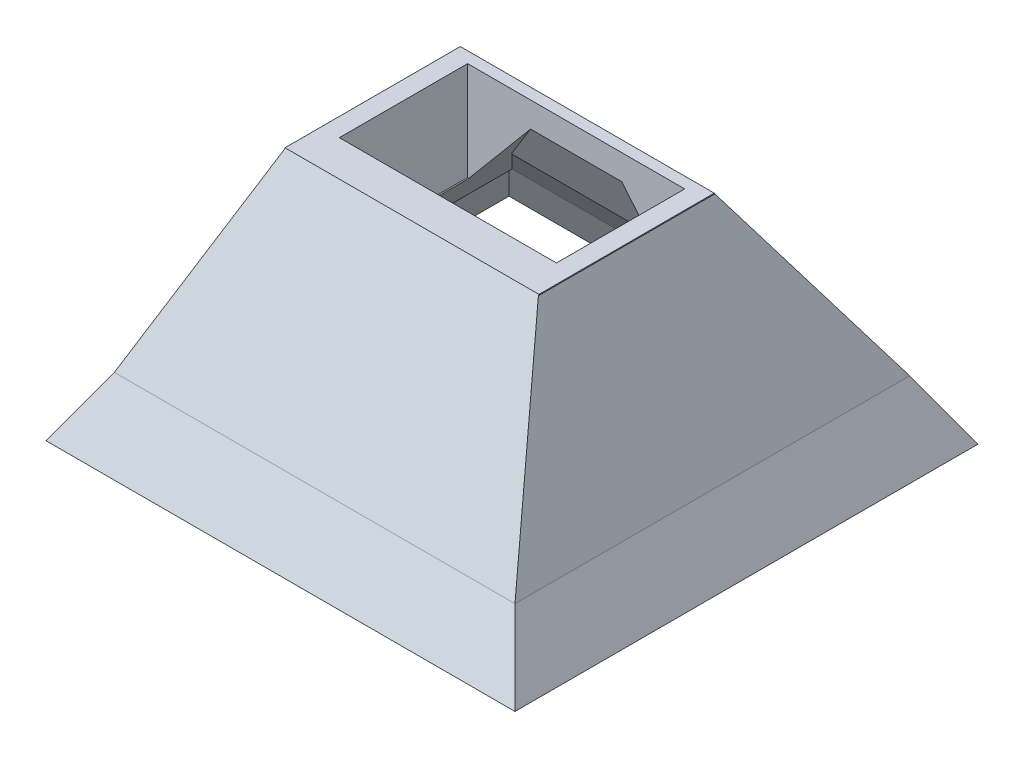
ISO-10303-21;
HEADER;
FILE_DESCRIPTION(('STEP AP214'),'2;1');
FILE_NAME('part.step','',(''),(''),'','','');
FILE_SCHEMA(('AUTOMOTIVE_DESIGN { 1 0 10303 214 1 1 1 1 }'));
ENDSEC;
DATA;
#1=APPLICATION_CONTEXT('core data for automotive mechanical design processes');
#2=APPLICATION_PROTOCOL_DEFINITION('international standard','automotive_design',2000,#1);
#3=PRODUCT_CONTEXT('',#1,'mechanical');
#4=PRODUCT('Part','Part','',(#3));
#5=PRODUCT_RELATED_PRODUCT_CATEGORY('part','',(#4));
#6=PRODUCT_DEFINITION_FORMATION('','',#4);
#7=PRODUCT_DEFINITION_CONTEXT('part definition',#1,'design');
#8=PRODUCT_DEFINITION('design','',#6,#7);
#9=PRODUCT_DEFINITION_SHAPE('','',#8);
#10=(LENGTH_UNIT() NAMED_UNIT(*) SI_UNIT(.MILLI.,.METRE.));
#11=(NAMED_UNIT(*) PLANE_ANGLE_UNIT() SI_UNIT($,.RADIAN.));
#12=(NAMED_UNIT(*) SI_UNIT($,.STERADIAN.) SOLID_ANGLE_UNIT());
#13=UNCERTAINTY_MEASURE_WITH_UNIT(LENGTH_MEASURE(1.E-05),#10,'distance_accuracy_value','');
#14=(GEOMETRIC_REPRESENTATION_CONTEXT(3) GLOBAL_UNCERTAINTY_ASSIGNED_CONTEXT((#13)) GLOBAL_UNIT_ASSIGNED_CONTEXT((#10,
#11,#12)) REPRESENTATION_CONTEXT('',''));
#15=CARTESIAN_POINT('',(0.,0.,0.));
#16=DIRECTION('',(0.,0.,1.));
#17=DIRECTION('',(1.,0.,0.));
#18=AXIS2_PLACEMENT_3D('',#15,#16,#17);
#19=CARTESIAN_POINT('',(0.,8.5,0.));
#20=DIRECTION('',(0.,-1.,0.));
#21=DIRECTION('',(0.,0.,-1.));
#22=AXIS2_PLACEMENT_3D('',#19,#20,#21);
#23=PLANE('',#22);
#24=DIRECTION('',(0.,0.,-1.));
#25=VECTOR('',#24,1.);
#26=CARTESIAN_POINT('',(-10.8676531349931,8.5,0.));
#27=LINE('',#26,#25);
#28=CARTESIAN_POINT('',(-10.8676531349931,8.5,10.8676531349931));
#29=VERTEX_POINT('',#28);
#30=CARTESIAN_POINT('',(-10.8676531349931,8.5,10.8));
#31=VERTEX_POINT('',#30);
#32=EDGE_CURVE('E412',#29,#31,#27,.T.);
#33=ORIENTED_EDGE('',*,*,#32,.T.);
#34=DIRECTION('',(1.,0.,0.));
#35=VECTOR('',#34,1.);
#36=CARTESIAN_POINT('',(10.8676531349931,8.5,10.8));
#37=LINE('',#36,#35);
#38=CARTESIAN_POINT('',(10.8676531349931,8.5,10.8));
#39=VERTEX_POINT('',#38);
#40=EDGE_CURVE('E471',#31,#39,#37,.T.);
#41=ORIENTED_EDGE('',*,*,#40,.T.);
#42=DIRECTION('',(0.,0.,1.));
#43=VECTOR('',#42,1.);
#44=CARTESIAN_POINT('',(10.8676531349931,8.5,0.));
#45=LINE('',#44,#43);
#46=CARTESIAN_POINT('',(10.8676531349931,8.5,10.8676531349931));
#47=VERTEX_POINT('',#46);
#48=EDGE_CURVE('E421',#39,#47,#45,.T.);
#49=ORIENTED_EDGE('',*,*,#48,.T.);
#50=DIRECTION('',(-1.,0.,0.));
#51=VECTOR('',#50,1.);
#52=CARTESIAN_POINT('',(0.,8.5,10.8676531349931));
#53=LINE('',#52,#51);
#54=EDGE_CURVE('E396',#47,#29,#53,.T.);
#55=ORIENTED_EDGE('',*,*,#54,.T.);
#56=EDGE_LOOP('',(#33,#41,#49,#55));
#57=FACE_BOUND('',#56,.T.);
#58=ADVANCED_FACE('F41',(#57),#23,.T.);
#59=CARTESIAN_POINT('',(18.,0.,-18.));
#60=DIRECTION('',(0.766044443118977,0.64278760968654,0.));
#61=DIRECTION('',(-0.64278760968654,0.766044443118977,0.));
#62=AXIS2_PLACEMENT_3D('',#59,#60,#61);
#63=PLANE('',#62);
#64=DIRECTION('',(0.540716203060937,-0.644400477571771,-0.540716203060937));
#65=VECTOR('',#64,1.);
#66=CARTESIAN_POINT('',(7.47453555890507,12.5437600613975,-7.47453555890508));
#67=LINE('',#66,#65);
#68=CARTESIAN_POINT('',(10.8676531349931,8.5,-10.8676531349931));
#69=VERTEX_POINT('',#68);
#70=CARTESIAN_POINT('',(18.,0.,-18.));
#71=VERTEX_POINT('',#70);
#72=EDGE_CURVE('E393',#69,#71,#67,.T.);
#73=ORIENTED_EDGE('',*,*,#72,.T.);
#74=DIRECTION('',(0.,0.,1.));
#75=VECTOR('',#74,1.);
#76=CARTESIAN_POINT('',(18.,0.,-18.));
#77=LINE('',#76,#75);
#78=CARTESIAN_POINT('',(18.,0.,18.));
#79=VERTEX_POINT('',#78);
#80=EDGE_CURVE('E232',#71,#79,#77,.T.);
#81=ORIENTED_EDGE('',*,*,#80,.T.);
#82=DIRECTION('',(0.540716203060937,-0.644400477571771,0.540716203060937));
#83=VECTOR('',#82,1.);
#84=CARTESIAN_POINT('',(7.47453555890506,12.5437600613975,7.47453555890507));
#85=LINE('',#84,#83);
#86=EDGE_CURVE('E392',#47,#79,#85,.T.);
#87=ORIENTED_EDGE('',*,*,#86,.F.);
#88=ORIENTED_EDGE('',*,*,#48,.F.);
#89=DIRECTION('',(-0.587858883152556,0.700582935935476,-0.404481746652007));
#90=VECTOR('',#89,1.);
#91=CARTESIAN_POINT('',(9.98509713369243,9.55178928521565,10.19274917305));
#92=LINE('',#91,#90);
#93=CARTESIAN_POINT('',(4.61819140160425,15.9478184725462,6.5));
#94=VERTEX_POINT('',#93);
#95=EDGE_CURVE('E483',#39,#94,#92,.T.);
#96=ORIENTED_EDGE('',*,*,#95,.T.);
#97=DIRECTION('',(-0.64278760968654,0.766044443118977,0.));
#98=VECTOR('',#97,1.);
#99=CARTESIAN_POINT('',(-3.09157313919248,25.1359580620961,6.5));
#100=LINE('',#99,#98);
#101=CARTESIAN_POINT('',(10.8676531349931,8.5,6.5));
#102=VERTEX_POINT('',#101);
#103=EDGE_CURVE('E460',#102,#94,#100,.T.);
#104=ORIENTED_EDGE('',*,*,#103,.F.);
#105=CARTESIAN_POINT('',(10.8676531349931,8.5,-6.5));
#106=VERTEX_POINT('',#105);
#107=EDGE_CURVE('E427',#106,#102,#45,.T.);
#108=ORIENTED_EDGE('',*,*,#107,.F.);
#109=DIRECTION('',(0.64278760968654,-0.766044443118977,0.));
#110=VECTOR('',#109,1.);
#111=CARTESIAN_POINT('',(-3.09157313919248,25.1359580620961,-6.5));
#112=LINE('',#111,#110);
#113=CARTESIAN_POINT('',(4.61819140160424,15.9478184725462,-6.5));
#114=VERTEX_POINT('',#113);
#115=EDGE_CURVE('E454',#114,#106,#112,.T.);
#116=ORIENTED_EDGE('',*,*,#115,.F.);
#117=DIRECTION('',(0.587858883152556,-0.700582935935476,-0.404481746652007));
#118=VECTOR('',#117,1.);
#119=CARTESIAN_POINT('',(18.5451118960204,-0.649639060448165,-16.0825465745377));
#120=LINE('',#119,#118);
#121=CARTESIAN_POINT('',(10.8676531349931,8.5,-10.8));
#122=VERTEX_POINT('',#121);
#123=EDGE_CURVE('E474',#114,#122,#120,.T.);
#124=ORIENTED_EDGE('',*,*,#123,.T.);
#125=EDGE_CURVE('E422',#69,#122,#45,.T.);
#126=ORIENTED_EDGE('',*,*,#125,.F.);
#127=EDGE_LOOP('',(#73,#81,#87,#88,#96,#104,#108,#116,#124,#126));
#128=FACE_BOUND('',#127,.T.);
#129=ADVANCED_FACE('F520',(#128),#63,.F.);
#130=CARTESIAN_POINT('',(-18.,0.,-18.));
#131=DIRECTION('',(0.,0.64278760968654,-0.766044443118977));
#132=DIRECTION('',(0.,0.766044443118977,0.64278760968654));
#133=AXIS2_PLACEMENT_3D('',#130,#131,#132);
#134=PLANE('',#133);
#135=DIRECTION('',(-0.540716203060937,-0.644400477571771,-0.540716203060937));
#136=VECTOR('',#135,1.);
#137=CARTESIAN_POINT('',(-18.,0.,-18.));
#138=LINE('',#137,#136);
#139=CARTESIAN_POINT('',(-10.8676531349931,8.5,-10.8676531349931));
#140=VERTEX_POINT('',#139);
#141=CARTESIAN_POINT('',(-18.,0.,-18.));
#142=VERTEX_POINT('',#141);
#143=EDGE_CURVE('E397',#140,#142,#138,.T.);
#144=ORIENTED_EDGE('',*,*,#143,.T.);
#145=DIRECTION('',(1.,0.,0.));
#146=VECTOR('',#145,1.);
#147=CARTESIAN_POINT('',(-18.,0.,-18.));
#148=LINE('',#147,#146);
#149=EDGE_CURVE('E388',#142,#71,#148,.T.);
#150=ORIENTED_EDGE('',*,*,#149,.T.);
#151=ORIENTED_EDGE('',*,*,#72,.F.);
#152=DIRECTION('',(1.,0.,0.));
#153=VECTOR('',#152,1.);
#154=CARTESIAN_POINT('',(0.,8.5,-10.8676531349931));
#155=LINE('',#154,#153);
#156=EDGE_CURVE('E416',#140,#69,#155,.T.);
#157=ORIENTED_EDGE('',*,*,#156,.F.);
#158=EDGE_LOOP('',(#144,#150,#151,#157));
#159=FACE_BOUND('',#158,.T.);
#160=ADVANCED_FACE('F525',(#159),#134,.F.);
#161=CARTESIAN_POINT('',(-18.,0.,-18.));
#162=DIRECTION('',(-0.766044443118977,0.64278760968654,0.));
#163=DIRECTION('',(-0.64278760968654,-0.766044443118977,0.));
#164=AXIS2_PLACEMENT_3D('',#161,#162,#163);
#165=PLANE('',#164);
#166=DIRECTION('',(-0.540716203060937,-0.644400477571771,0.540716203060937));
#167=VECTOR('',#166,1.);
#168=CARTESIAN_POINT('',(-18.,0.,18.));
#169=LINE('',#168,#167);
#170=CARTESIAN_POINT('',(-18.,0.,18.));
#171=VERTEX_POINT('',#170);
#172=EDGE_CURVE('E401',#29,#171,#169,.T.);
#173=ORIENTED_EDGE('',*,*,#172,.T.);
#174=DIRECTION('',(0.,0.,-1.));
#175=VECTOR('',#174,1.);
#176=CARTESIAN_POINT('',(-18.,0.,-18.));
#177=LINE('',#176,#175);
#178=EDGE_CURVE('E384',#171,#142,#177,.T.);
#179=ORIENTED_EDGE('',*,*,#178,.T.);
#180=ORIENTED_EDGE('',*,*,#143,.F.);
#181=CARTESIAN_POINT('',(-10.8676531349931,8.5,-10.8));
#182=VERTEX_POINT('',#181);
#183=EDGE_CURVE('E411',#182,#140,#27,.T.);
#184=ORIENTED_EDGE('',*,*,#183,.F.);
#185=DIRECTION('',(0.587858883152556,0.700582935935476,0.404481746652007));
#186=VECTOR('',#185,1.);
#187=CARTESIAN_POINT('',(-18.5451118960204,-0.649639060448165,-16.0825465745377));
#188=LINE('',#187,#186);
#189=CARTESIAN_POINT('',(-4.61819140160425,15.9478184725462,-6.5));
#190=VERTEX_POINT('',#189);
#191=EDGE_CURVE('E477',#182,#190,#188,.T.);
#192=ORIENTED_EDGE('',*,*,#191,.T.);
#193=DIRECTION('',(0.64278760968654,0.766044443118977,0.));
#194=VECTOR('',#193,1.);
#195=CARTESIAN_POINT('',(-5.99829690647131,14.3030727789618,-6.5));
#196=LINE('',#195,#194);
#197=CARTESIAN_POINT('',(-10.8676531349931,8.5,-6.5));
#198=VERTEX_POINT('',#197);
#199=EDGE_CURVE('E446',#198,#190,#196,.T.);
#200=ORIENTED_EDGE('',*,*,#199,.F.);
#201=CARTESIAN_POINT('',(-10.8676531349931,8.5,6.5));
#202=VERTEX_POINT('',#201);
#203=EDGE_CURVE('E417',#202,#198,#27,.T.);
#204=ORIENTED_EDGE('',*,*,#203,.F.);
#205=DIRECTION('',(-0.64278760968654,-0.766044443118977,0.));
#206=VECTOR('',#205,1.);
#207=CARTESIAN_POINT('',(-5.99829690647131,14.3030727789618,6.5));
#208=LINE('',#207,#206);
#209=CARTESIAN_POINT('',(-4.61819140160426,15.9478184725462,6.5));
#210=VERTEX_POINT('',#209);
#211=EDGE_CURVE('E468',#210,#202,#208,.T.);
#212=ORIENTED_EDGE('',*,*,#211,.F.);
#213=DIRECTION('',(-0.587858883152556,-0.700582935935476,0.404481746652007));
#214=VECTOR('',#213,1.);
#215=CARTESIAN_POINT('',(-9.98509713369243,9.55178928521565,10.19274917305));
#216=LINE('',#215,#214);
#217=EDGE_CURVE('E480',#210,#31,#216,.T.);
#218=ORIENTED_EDGE('',*,*,#217,.T.);
#219=ORIENTED_EDGE('',*,*,#32,.F.);
#220=EDGE_LOOP('',(#173,#179,#180,#184,#192,#200,#204,#212,#218,#219));
#221=FACE_BOUND('',#220,.T.);
#222=ADVANCED_FACE('F512',(#221),#165,.F.);
#223=CARTESIAN_POINT('',(-18.,0.,18.));
#224=DIRECTION('',(0.,0.64278760968654,0.766044443118977));
#225=DIRECTION('',(0.,-0.766044443118977,0.64278760968654));
#226=AXIS2_PLACEMENT_3D('',#223,#224,#225);
#227=PLANE('',#226);
#228=ORIENTED_EDGE('',*,*,#86,.T.);
#229=DIRECTION('',(-1.,0.,0.));
#230=VECTOR('',#229,1.);
#231=CARTESIAN_POINT('',(-18.,0.,18.));
#232=LINE('',#231,#230);
#233=EDGE_CURVE('E380',#79,#171,#232,.T.);
#234=ORIENTED_EDGE('',*,*,#233,.T.);
#235=ORIENTED_EDGE('',*,*,#172,.F.);
#236=ORIENTED_EDGE('',*,*,#54,.F.);
#237=EDGE_LOOP('',(#228,#234,#235,#236));
#238=FACE_BOUND('',#237,.T.);
#239=ADVANCED_FACE('F516',(#238),#227,.F.);
#240=ORIENTED_EDGE('',*,*,#125,.T.);
#241=DIRECTION('',(-1.,0.,0.));
#242=VECTOR('',#241,1.);
#243=CARTESIAN_POINT('',(-10.8676531349931,8.5,-10.8));
#244=LINE('',#243,#242);
#245=EDGE_CURVE('E457',#122,#182,#244,.T.);
#246=ORIENTED_EDGE('',*,*,#245,.T.);
#247=ORIENTED_EDGE('',*,*,#183,.T.);
#248=ORIENTED_EDGE('',*,*,#156,.T.);
#249=EDGE_LOOP('',(#240,#246,#247,#248));
#250=FACE_BOUND('',#249,.T.);
#251=ADVANCED_FACE('F574',(#250),#23,.T.);
#252=CARTESIAN_POINT('',(12.8676531349931,18.5,12.8676531349931));
#253=DIRECTION('',(-1.,0.,0.));
#254=DIRECTION('',(0.,0.,1.));
#255=AXIS2_PLACEMENT_3D('',#252,#253,#254);
#256=PLANE('',#255);
#257=DIRECTION('',(0.,0.,-1.));
#258=VECTOR('',#257,1.);
#259=CARTESIAN_POINT('',(12.8676531349931,18.398928629861,-12.8676531349931));
#260=LINE('',#259,#258);
#261=CARTESIAN_POINT('',(12.8676531349931,18.398928629861,10.1938683086254));
#262=VERTEX_POINT('',#261);
#263=CARTESIAN_POINT('',(12.8676531349931,18.398928629861,-7.69758123506049));
#264=VERTEX_POINT('',#263);
#265=EDGE_CURVE('E426',#262,#264,#260,.T.);
#266=ORIENTED_EDGE('',*,*,#265,.T.);
#267=DIRECTION('',(0.,0.831289081728702,0.555840321134273));
#268=VECTOR('',#267,1.);
#269=CARTESIAN_POINT('',(12.8676531349931,27.9712273961323,-1.29707660053211));
#270=LINE('',#269,#268);
#271=CARTESIAN_POINT('',(12.8676531349931,18.5,-7.63));
#272=VERTEX_POINT('',#271);
#273=EDGE_CURVE('E66',#264,#272,#270,.T.);
#274=ORIENTED_EDGE('',*,*,#273,.T.);
#275=DIRECTION('',(0.,0.,-1.));
#276=VECTOR('',#275,1.);
#277=CARTESIAN_POINT('',(12.8676531349931,18.5,12.8676531349931));
#278=LINE('',#277,#276);
#279=CARTESIAN_POINT('',(12.8676531349931,18.5,10.14));
#280=VERTEX_POINT('',#279);
#281=EDGE_CURVE('E362',#280,#272,#278,.T.);
#282=ORIENTED_EDGE('',*,*,#281,.F.);
#283=DIRECTION('',(0.,-0.88248495319256,0.470340629106954));
#284=VECTOR('',#283,1.);
#285=CARTESIAN_POINT('',(12.8676531349931,17.3678370281947,10.743412264973));
#286=LINE('',#285,#284);
#287=EDGE_CURVE('E309',#280,#262,#286,.T.);
#288=ORIENTED_EDGE('',*,*,#287,.T.);
#289=EDGE_LOOP('',(#266,#274,#282,#288));
#290=FACE_BOUND('',#289,.T.);
#291=ADVANCED_FACE('F582',(#290),#256,.F.);
#292=CARTESIAN_POINT('',(-12.8676531349931,18.5,12.8676531349931));
#293=DIRECTION('',(1.,0.,0.));
#294=DIRECTION('',(0.,0.,-1.));
#295=AXIS2_PLACEMENT_3D('',#292,#293,#294);
#296=PLANE('',#295);
#297=DIRECTION('',(0.,0.,1.));
#298=VECTOR('',#297,1.);
#299=CARTESIAN_POINT('',(-12.8676531349931,18.5,12.8676531349931));
#300=LINE('',#299,#298);
#301=CARTESIAN_POINT('',(-12.8676531349931,18.5,-7.63));
#302=VERTEX_POINT('',#301);
#303=CARTESIAN_POINT('',(-12.8676531349931,18.5,10.14));
#304=VERTEX_POINT('',#303);
#305=EDGE_CURVE('E375',#302,#304,#300,.T.);
#306=ORIENTED_EDGE('',*,*,#305,.F.);
#307=DIRECTION('',(0.,-0.831289081728702,-0.555840321134273));
#308=VECTOR('',#307,1.);
#309=CARTESIAN_POINT('',(-12.8676531349931,27.9712273961323,-1.29707660053211));
#310=LINE('',#309,#308);
#311=CARTESIAN_POINT('',(-12.8676531349931,18.398928629861,-7.69758123506048));
#312=VERTEX_POINT('',#311);
#313=EDGE_CURVE('E300',#302,#312,#310,.T.);
#314=ORIENTED_EDGE('',*,*,#313,.T.);
#315=DIRECTION('',(0.,0.,1.));
#316=VECTOR('',#315,1.);
#317=CARTESIAN_POINT('',(-12.8676531349931,18.398928629861,12.8676531349931));
#318=LINE('',#317,#316);
#319=CARTESIAN_POINT('',(-12.8676531349931,18.398928629861,10.1938683086254));
#320=VERTEX_POINT('',#319);
#321=EDGE_CURVE('E431',#312,#320,#318,.T.);
#322=ORIENTED_EDGE('',*,*,#321,.T.);
#323=DIRECTION('',(0.,0.88248495319256,-0.470340629106954));
#324=VECTOR('',#323,1.);
#325=CARTESIAN_POINT('',(-12.8676531349931,17.3678370281947,10.743412264973));
#326=LINE('',#325,#324);
#327=EDGE_CURVE('E319',#320,#304,#326,.T.);
#328=ORIENTED_EDGE('',*,*,#327,.T.);
#329=EDGE_LOOP('',(#306,#314,#322,#328));
#330=FACE_BOUND('',#329,.T.);
#331=ADVANCED_FACE('F566',(#330),#296,.F.);
#332=CARTESIAN_POINT('',(0.,18.5,0.));
#333=DIRECTION('',(0.,-1.,0.));
#334=DIRECTION('',(0.,0.,-1.));
#335=AXIS2_PLACEMENT_3D('',#332,#333,#334);
#336=PLANE('',#335);
#337=DIRECTION('',(1.,0.,0.));
#338=VECTOR('',#337,1.);
#339=CARTESIAN_POINT('',(-11.,18.5,-6.5));
#340=LINE('',#339,#338);
#341=CARTESIAN_POINT('',(-11.,18.5,-6.5));
#342=VERTEX_POINT('',#341);
#343=CARTESIAN_POINT('',(11.,18.5,-6.5));
#344=VERTEX_POINT('',#343);
#345=EDGE_CURVE('E337',#342,#344,#340,.T.);
#346=ORIENTED_EDGE('',*,*,#345,.T.);
#347=DIRECTION('',(0.,0.,1.));
#348=VECTOR('',#347,1.);
#349=CARTESIAN_POINT('',(11.,18.5,-6.5));
#350=LINE('',#349,#348);
#351=CARTESIAN_POINT('',(11.,18.5,6.5));
#352=VERTEX_POINT('',#351);
#353=EDGE_CURVE('E324',#344,#352,#350,.T.);
#354=ORIENTED_EDGE('',*,*,#353,.T.);
#355=DIRECTION('',(-1.,0.,0.));
#356=VECTOR('',#355,1.);
#357=CARTESIAN_POINT('',(-11.,18.5,6.5));
#358=LINE('',#357,#356);
#359=CARTESIAN_POINT('',(-11.,18.5,6.5));
#360=VERTEX_POINT('',#359);
#361=EDGE_CURVE('E328',#352,#360,#358,.T.);
#362=ORIENTED_EDGE('',*,*,#361,.T.);
#363=DIRECTION('',(0.,0.,-1.));
#364=VECTOR('',#363,1.);
#365=CARTESIAN_POINT('',(-11.,18.5,-6.5));
#366=LINE('',#365,#364);
#367=EDGE_CURVE('E333',#360,#342,#366,.T.);
#368=ORIENTED_EDGE('',*,*,#367,.T.);
#369=EDGE_LOOP('',(#346,#354,#362,#368));
#370=FACE_BOUND('',#369,.T.);
#371=ORIENTED_EDGE('',*,*,#281,.T.);
#372=DIRECTION('',(1.,0.,0.));
#373=VECTOR('',#372,1.);
#374=CARTESIAN_POINT('',(-20.3013028287262,18.5,-7.63));
#375=LINE('',#374,#373);
#376=EDGE_CURVE('E289',#302,#272,#375,.T.);
#377=ORIENTED_EDGE('',*,*,#376,.F.);
#378=ORIENTED_EDGE('',*,*,#305,.T.);
#379=DIRECTION('',(1.,0.,0.));
#380=VECTOR('',#379,1.);
#381=CARTESIAN_POINT('',(-20.3013028287262,18.5,10.14));
#382=LINE('',#381,#380);
#383=EDGE_CURVE('E305',#304,#280,#382,.T.);
#384=ORIENTED_EDGE('',*,*,#383,.T.);
#385=EDGE_LOOP('',(#371,#377,#378,#384));
#386=FACE_BOUND('',#385,.T.);
#387=ADVANCED_FACE('F558',(#370,#386),#336,.F.);
#388=CARTESIAN_POINT('',(0.,8.5,0.));
#389=DIRECTION('',(0.,1.,0.));
#390=DIRECTION('',(0.,0.,1.));
#391=AXIS2_PLACEMENT_3D('',#388,#389,#390);
#392=PLANE('',#391);
#393=ORIENTED_EDGE('',*,*,#203,.T.);
#394=DIRECTION('',(1.,0.,0.));
#395=VECTOR('',#394,1.);
#396=CARTESIAN_POINT('',(-11.,8.5,-6.5));
#397=LINE('',#396,#395);
#398=CARTESIAN_POINT('',(-11.,8.5,-6.5));
#399=VERTEX_POINT('',#398);
#400=EDGE_CURVE('E329',#399,#198,#397,.T.);
#401=ORIENTED_EDGE('',*,*,#400,.F.);
#402=DIRECTION('',(0.,0.,-1.));
#403=VECTOR('',#402,1.);
#404=CARTESIAN_POINT('',(-11.,8.5,-6.5));
#405=LINE('',#404,#403);
#406=CARTESIAN_POINT('',(-11.,8.5,6.5));
#407=VERTEX_POINT('',#406);
#408=EDGE_CURVE('E350',#407,#399,#405,.T.);
#409=ORIENTED_EDGE('',*,*,#408,.F.);
#410=DIRECTION('',(-1.,0.,0.));
#411=VECTOR('',#410,1.);
#412=CARTESIAN_POINT('',(-11.,8.5,6.5));
#413=LINE('',#412,#411);
#414=EDGE_CURVE('E345',#202,#407,#413,.T.);
#415=ORIENTED_EDGE('',*,*,#414,.F.);
#416=EDGE_LOOP('',(#393,#401,#409,#415));
#417=FACE_BOUND('',#416,.T.);
#418=ADVANCED_FACE('F555',(#417),#392,.T.);
#419=ORIENTED_EDGE('',*,*,#107,.T.);
#420=CARTESIAN_POINT('',(11.,8.5,6.5));
#421=VERTEX_POINT('',#420);
#422=EDGE_CURVE('E346',#421,#102,#413,.T.);
#423=ORIENTED_EDGE('',*,*,#422,.F.);
#424=DIRECTION('',(0.,0.,1.));
#425=VECTOR('',#424,1.);
#426=CARTESIAN_POINT('',(11.,8.5,-6.5));
#427=LINE('',#426,#425);
#428=CARTESIAN_POINT('',(11.,8.5,-6.5));
#429=VERTEX_POINT('',#428);
#430=EDGE_CURVE('E323',#429,#421,#427,.T.);
#431=ORIENTED_EDGE('',*,*,#430,.F.);
#432=EDGE_CURVE('E354',#106,#429,#397,.T.);
#433=ORIENTED_EDGE('',*,*,#432,.F.);
#434=EDGE_LOOP('',(#419,#423,#431,#433));
#435=FACE_BOUND('',#434,.T.);
#436=ADVANCED_FACE('F557',(#435),#392,.T.);
#437=CARTESIAN_POINT('',(11.,18.5,-6.5));
#438=DIRECTION('',(1.,0.,0.));
#439=DIRECTION('',(0.,0.,-1.));
#440=AXIS2_PLACEMENT_3D('',#437,#438,#439);
#441=PLANE('',#440);
#442=ORIENTED_EDGE('',*,*,#430,.T.);
#443=DIRECTION('',(0.,-1.,0.));
#444=VECTOR('',#443,1.);
#445=CARTESIAN_POINT('',(11.,18.5,6.5));
#446=LINE('',#445,#444);
#447=EDGE_CURVE('E341',#352,#421,#446,.T.);
#448=ORIENTED_EDGE('',*,*,#447,.F.);
#449=ORIENTED_EDGE('',*,*,#353,.F.);
#450=DIRECTION('',(0.,-1.,0.));
#451=VECTOR('',#450,1.);
#452=CARTESIAN_POINT('',(11.,18.5,-6.5));
#453=LINE('',#452,#451);
#454=EDGE_CURVE('E358',#344,#429,#453,.T.);
#455=ORIENTED_EDGE('',*,*,#454,.T.);
#456=EDGE_LOOP('',(#442,#448,#449,#455));
#457=FACE_BOUND('',#456,.T.);
#458=ADVANCED_FACE('F564',(#457),#441,.F.);
#459=CARTESIAN_POINT('',(-11.,18.5,-6.5));
#460=DIRECTION('',(0.,0.,-1.));
#461=DIRECTION('',(-1.,0.,0.));
#462=AXIS2_PLACEMENT_3D('',#459,#460,#461);
#463=PLANE('',#462);
#464=DIRECTION('',(1.,0.,0.));
#465=VECTOR('',#464,1.);
#466=CARTESIAN_POINT('',(10.8676531349931,15.9478184725462,-6.5));
#467=LINE('',#466,#465);
#468=EDGE_CURVE('E450',#190,#114,#467,.T.);
#469=ORIENTED_EDGE('',*,*,#468,.T.);
#470=ORIENTED_EDGE('',*,*,#115,.T.);
#471=ORIENTED_EDGE('',*,*,#432,.T.);
#472=ORIENTED_EDGE('',*,*,#454,.F.);
#473=ORIENTED_EDGE('',*,*,#345,.F.);
#474=DIRECTION('',(0.,-1.,0.));
#475=VECTOR('',#474,1.);
#476=CARTESIAN_POINT('',(-11.,18.5,-6.5));
#477=LINE('',#476,#475);
#478=EDGE_CURVE('E363',#342,#399,#477,.T.);
#479=ORIENTED_EDGE('',*,*,#478,.T.);
#480=ORIENTED_EDGE('',*,*,#400,.T.);
#481=ORIENTED_EDGE('',*,*,#199,.T.);
#482=EDGE_LOOP('',(#469,#470,#471,#472,#473,#479,#480,#481));
#483=FACE_BOUND('',#482,.T.);
#484=ADVANCED_FACE('F536',(#483),#463,.F.);
#485=CARTESIAN_POINT('',(-11.,18.5,-6.5));
#486=DIRECTION('',(-1.,0.,0.));
#487=DIRECTION('',(0.,0.,1.));
#488=AXIS2_PLACEMENT_3D('',#485,#486,#487);
#489=PLANE('',#488);
#490=ORIENTED_EDGE('',*,*,#408,.T.);
#491=ORIENTED_EDGE('',*,*,#478,.F.);
#492=ORIENTED_EDGE('',*,*,#367,.F.);
#493=DIRECTION('',(0.,-1.,0.));
#494=VECTOR('',#493,1.);
#495=CARTESIAN_POINT('',(-11.,18.5,6.5));
#496=LINE('',#495,#494);
#497=EDGE_CURVE('E366',#360,#407,#496,.T.);
#498=ORIENTED_EDGE('',*,*,#497,.T.);
#499=EDGE_LOOP('',(#490,#491,#492,#498));
#500=FACE_BOUND('',#499,.T.);
#501=ADVANCED_FACE('F554',(#500),#489,.F.);
#502=CARTESIAN_POINT('',(-11.,18.5,6.5));
#503=DIRECTION('',(0.,0.,1.));
#504=DIRECTION('',(1.,0.,0.));
#505=AXIS2_PLACEMENT_3D('',#502,#503,#504);
#506=PLANE('',#505);
#507=DIRECTION('',(-1.,0.,0.));
#508=VECTOR('',#507,1.);
#509=CARTESIAN_POINT('',(-10.8676531349931,15.9478184725462,6.5));
#510=LINE('',#509,#508);
#511=EDGE_CURVE('E464',#94,#210,#510,.T.);
#512=ORIENTED_EDGE('',*,*,#511,.T.);
#513=ORIENTED_EDGE('',*,*,#211,.T.);
#514=ORIENTED_EDGE('',*,*,#414,.T.);
#515=ORIENTED_EDGE('',*,*,#497,.F.);
#516=ORIENTED_EDGE('',*,*,#361,.F.);
#517=ORIENTED_EDGE('',*,*,#447,.T.);
#518=ORIENTED_EDGE('',*,*,#422,.T.);
#519=ORIENTED_EDGE('',*,*,#103,.T.);
#520=EDGE_LOOP('',(#512,#513,#514,#515,#516,#517,#518,#519));
#521=FACE_BOUND('',#520,.T.);
#522=ADVANCED_FACE('F550',(#521),#506,.F.);
#523=CARTESIAN_POINT('',(-12.8676531349931,18.398928629861,12.8676531349931));
#524=DIRECTION('',(0.927183854566789,-0.374606593415909,0.));
#525=DIRECTION('',(0.,0.,1.));
#526=AXIS2_PLACEMENT_3D('',#523,#524,#525);
#527=PLANE('',#526);
#528=ORIENTED_EDGE('',*,*,#321,.F.);
#529=DIRECTION('',(-0.318384822463637,-0.788030088407036,-0.52691525370784));
#530=VECTOR('',#529,1.);
#531=CARTESIAN_POINT('',(-9.417591998523,26.9381295922207,-1.98785605103943));
#532=LINE('',#531,#530);
#533=CARTESIAN_POINT('',(-20.3013028287262,0.,-20.));
#534=VERTEX_POINT('',#533);
#535=EDGE_CURVE('E297',#312,#534,#532,.T.);
#536=ORIENTED_EDGE('',*,*,#535,.T.);
#537=DIRECTION('',(0.,0.,-1.));
#538=VECTOR('',#537,1.);
#539=CARTESIAN_POINT('',(-20.3013028287262,0.,12.8676531349931));
#540=LINE('',#539,#538);
#541=CARTESIAN_POINT('',(-20.3013028287262,0.,20.));
#542=VERTEX_POINT('',#541);
#543=EDGE_CURVE('E438',#542,#534,#540,.T.);
#544=ORIENTED_EDGE('',*,*,#543,.F.);
#545=DIRECTION('',(0.335838644601319,0.83122981412188,-0.44302302525631));
#546=VECTOR('',#545,1.);
#547=CARTESIAN_POINT('',(-13.2654702112735,17.4142968142949,10.7186504546515));
#548=LINE('',#547,#546);
#549=EDGE_CURVE('E315',#542,#320,#548,.T.);
#550=ORIENTED_EDGE('',*,*,#549,.T.);
#551=EDGE_LOOP('',(#528,#536,#544,#550));
#552=FACE_BOUND('',#551,.T.);
#553=ADVANCED_FACE('F607',(#552),#527,.F.);
#554=CARTESIAN_POINT('',(12.8676531349931,18.398928629861,12.8676531349931));
#555=DIRECTION('',(-0.927183854566789,-0.374606593415909,0.));
#556=DIRECTION('',(0.,0.,-1.));
#557=AXIS2_PLACEMENT_3D('',#554,#555,#556);
#558=PLANE('',#557);
#559=DIRECTION('',(0.,0.,1.));
#560=VECTOR('',#559,1.);
#561=CARTESIAN_POINT('',(20.3013028287262,0.,12.8676531349931));
#562=LINE('',#561,#560);
#563=CARTESIAN_POINT('',(20.3013028287262,0.,-20.));
#564=VERTEX_POINT('',#563);
#565=CARTESIAN_POINT('',(20.3013028287262,0.,20.));
#566=VERTEX_POINT('',#565);
#567=EDGE_CURVE('E434',#564,#566,#562,.T.);
#568=ORIENTED_EDGE('',*,*,#567,.F.);
#569=DIRECTION('',(-0.318384822463637,0.788030088407036,0.52691525370784));
#570=VECTOR('',#569,1.);
#571=CARTESIAN_POINT('',(9.417591998523,26.9381295922207,-1.98785605103944));
#572=LINE('',#571,#570);
#573=EDGE_CURVE('E486',#564,#264,#572,.T.);
#574=ORIENTED_EDGE('',*,*,#573,.T.);
#575=ORIENTED_EDGE('',*,*,#265,.F.);
#576=DIRECTION('',(0.335838644601319,-0.83122981412188,0.44302302525631));
#577=VECTOR('',#576,1.);
#578=CARTESIAN_POINT('',(13.2654702112735,17.4142968142949,10.7186504546515));
#579=LINE('',#578,#577);
#580=EDGE_CURVE('E442',#262,#566,#579,.T.);
#581=ORIENTED_EDGE('',*,*,#580,.T.);
#582=EDGE_LOOP('',(#568,#574,#575,#581));
#583=FACE_BOUND('',#582,.T.);
#584=ADVANCED_FACE('F599',(#583),#558,.F.);
#585=CARTESIAN_POINT('',(-20.3013028287262,18.5,10.14));
#586=DIRECTION('',(0.,-0.470340629106954,-0.88248495319256));
#587=DIRECTION('',(0.,0.88248495319256,-0.470340629106954));
#588=AXIS2_PLACEMENT_3D('',#585,#586,#587);
#589=PLANE('',#588);
#590=ORIENTED_EDGE('',*,*,#549,.F.);
#591=DIRECTION('',(1.,0.,0.));
#592=VECTOR('',#591,1.);
#593=CARTESIAN_POINT('',(-20.3013028287262,0.,20.));
#594=LINE('',#593,#592);
#595=EDGE_CURVE('E304',#542,#566,#594,.T.);
#596=ORIENTED_EDGE('',*,*,#595,.T.);
#597=ORIENTED_EDGE('',*,*,#580,.F.);
#598=ORIENTED_EDGE('',*,*,#287,.F.);
#599=ORIENTED_EDGE('',*,*,#383,.F.);
#600=ORIENTED_EDGE('',*,*,#327,.F.);
#601=EDGE_LOOP('',(#590,#596,#597,#598,#599,#600));
#602=FACE_BOUND('',#601,.T.);
#603=ADVANCED_FACE('F606',(#602),#589,.F.);
#604=CARTESIAN_POINT('',(-11.,15.9478184725462,-6.5));
#605=DIRECTION('',(0.,-0.500000000000001,0.866025403784438));
#606=DIRECTION('',(-1.,0.,0.));
#607=AXIS2_PLACEMENT_3D('',#604,#605,#606);
#608=PLANE('',#607);
#609=ORIENTED_EDGE('',*,*,#191,.F.);
#610=ORIENTED_EDGE('',*,*,#245,.F.);
#611=ORIENTED_EDGE('',*,*,#123,.F.);
#612=ORIENTED_EDGE('',*,*,#468,.F.);
#613=EDGE_LOOP('',(#609,#610,#611,#612));
#614=FACE_BOUND('',#613,.T.);
#615=ADVANCED_FACE('F533',(#614),#608,.T.);
#616=CARTESIAN_POINT('',(-11.,15.9478184725462,6.5));
#617=DIRECTION('',(0.,-0.500000000000001,-0.866025403784438));
#618=DIRECTION('',(1.,0.,0.));
#619=AXIS2_PLACEMENT_3D('',#616,#617,#618);
#620=PLANE('',#619);
#621=ORIENTED_EDGE('',*,*,#95,.F.);
#622=ORIENTED_EDGE('',*,*,#40,.F.);
#623=ORIENTED_EDGE('',*,*,#217,.F.);
#624=ORIENTED_EDGE('',*,*,#511,.F.);
#625=EDGE_LOOP('',(#621,#622,#623,#624));
#626=FACE_BOUND('',#625,.T.);
#627=ADVANCED_FACE('F44',(#626),#620,.T.);
#628=CARTESIAN_POINT('',(-20.3013028287262,0.,-20.));
#629=DIRECTION('',(0.,-0.555840321134273,0.831289081728702));
#630=DIRECTION('',(0.,-0.831289081728702,-0.555840321134273));
#631=AXIS2_PLACEMENT_3D('',#628,#629,#630);
#632=PLANE('',#631);
#633=ORIENTED_EDGE('',*,*,#376,.T.);
#634=ORIENTED_EDGE('',*,*,#273,.F.);
#635=ORIENTED_EDGE('',*,*,#573,.F.);
#636=DIRECTION('',(1.,0.,0.));
#637=VECTOR('',#636,1.);
#638=CARTESIAN_POINT('',(-20.3013028287262,0.,-20.));
#639=LINE('',#638,#637);
#640=EDGE_CURVE('E264',#534,#564,#639,.T.);
#641=ORIENTED_EDGE('',*,*,#640,.F.);
#642=ORIENTED_EDGE('',*,*,#535,.F.);
#643=ORIENTED_EDGE('',*,*,#313,.F.);
#644=EDGE_LOOP('',(#633,#634,#635,#641,#642,#643));
#645=FACE_BOUND('',#644,.T.);
#646=ADVANCED_FACE('F620',(#645),#632,.F.);
#647=CARTESIAN_POINT('',(20.3013028287262,0.,-20.));
#648=DIRECTION('',(0.866025403784438,0.500000000000001,0.));
#649=DIRECTION('',(-0.500000000000001,0.866025403784438,0.));
#650=AXIS2_PLACEMENT_3D('',#647,#648,#649);
#651=PLANE('',#650);
#652=ORIENTED_EDGE('',*,*,#567,.T.);
#653=DIRECTION('',(-0.447213595499959,0.774596669241482,-0.447213595499959));
#654=VECTOR('',#653,1.);
#655=CARTESIAN_POINT('',(12.1807816972357,14.0651551836782,11.8794788685095));
#656=LINE('',#655,#654);
#657=CARTESIAN_POINT('',(23.765404443864,-6.,23.4641016151378));
#658=VERTEX_POINT('',#657);
#659=EDGE_CURVE('E260',#658,#566,#656,.T.);
#660=ORIENTED_EDGE('',*,*,#659,.F.);
#661=DIRECTION('',(0.,0.,-1.));
#662=VECTOR('',#661,1.);
#663=CARTESIAN_POINT('',(23.765404443864,-6.,0.));
#664=LINE('',#663,#662);
#665=CARTESIAN_POINT('',(23.765404443864,-6.,-23.4641016151378));
#666=VERTEX_POINT('',#665);
#667=EDGE_CURVE('E253',#666,#658,#664,.F.);
#668=ORIENTED_EDGE('',*,*,#667,.F.);
#669=DIRECTION('',(-0.447213595499959,0.774596669241482,0.447213595499959));
#670=VECTOR('',#669,1.);
#671=CARTESIAN_POINT('',(20.3013028287262,0.,-20.));
#672=LINE('',#671,#670);
#673=EDGE_CURVE('E266',#666,#564,#672,.T.);
#674=ORIENTED_EDGE('',*,*,#673,.T.);
#675=EDGE_LOOP('',(#652,#660,#668,#674));
#676=FACE_BOUND('',#675,.T.);
#677=ADVANCED_FACE('F628',(#676),#651,.T.);
#678=CARTESIAN_POINT('',(-20.3013028287262,0.,20.));
#679=DIRECTION('',(0.,0.500000000000001,0.866025403784438));
#680=DIRECTION('',(0.,-0.866025403784438,0.500000000000001));
#681=AXIS2_PLACEMENT_3D('',#678,#679,#680);
#682=PLANE('',#681);
#683=ORIENTED_EDGE('',*,*,#595,.F.);
#684=DIRECTION('',(0.447213595499959,0.774596669241482,-0.447213595499959));
#685=VECTOR('',#684,1.);
#686=CARTESIAN_POINT('',(-12.3013028287262,13.856406460551,12.));
#687=LINE('',#686,#685);
#688=CARTESIAN_POINT('',(-23.765404443864,-6.,23.4641016151378));
#689=VERTEX_POINT('',#688);
#690=EDGE_CURVE('E265',#689,#542,#687,.T.);
#691=ORIENTED_EDGE('',*,*,#690,.F.);
#692=DIRECTION('',(1.,0.,0.));
#693=VECTOR('',#692,1.);
#694=CARTESIAN_POINT('',(0.,-6.,23.4641016151378));
#695=LINE('',#694,#693);
#696=EDGE_CURVE('E281',#658,#689,#695,.F.);
#697=ORIENTED_EDGE('',*,*,#696,.F.);
#698=ORIENTED_EDGE('',*,*,#659,.T.);
#699=EDGE_LOOP('',(#683,#691,#697,#698));
#700=FACE_BOUND('',#699,.T.);
#701=ADVANCED_FACE('F629',(#700),#682,.T.);
#702=CARTESIAN_POINT('',(-20.3013028287262,0.,-20.));
#703=DIRECTION('',(-0.866025403784438,0.500000000000001,0.));
#704=DIRECTION('',(-0.500000000000001,-0.866025403784438,0.));
#705=AXIS2_PLACEMENT_3D('',#702,#703,#704);
#706=PLANE('',#705);
#707=ORIENTED_EDGE('',*,*,#543,.T.);
#708=DIRECTION('',(0.447213595499959,0.774596669241482,0.447213595499959));
#709=VECTOR('',#708,1.);
#710=CARTESIAN_POINT('',(-20.3013028287262,0.,-20.));
#711=LINE('',#710,#709);
#712=CARTESIAN_POINT('',(-23.765404443864,-6.,-23.4641016151378));
#713=VERTEX_POINT('',#712);
#714=EDGE_CURVE('E270',#713,#534,#711,.T.);
#715=ORIENTED_EDGE('',*,*,#714,.F.);
#716=DIRECTION('',(0.,0.,1.));
#717=VECTOR('',#716,1.);
#718=CARTESIAN_POINT('',(-23.765404443864,-6.,0.));
#719=LINE('',#718,#717);
#720=EDGE_CURVE('E284',#689,#713,#719,.F.);
#721=ORIENTED_EDGE('',*,*,#720,.F.);
#722=ORIENTED_EDGE('',*,*,#690,.T.);
#723=EDGE_LOOP('',(#707,#715,#721,#722));
#724=FACE_BOUND('',#723,.T.);
#725=ADVANCED_FACE('F632',(#724),#706,.T.);
#726=CARTESIAN_POINT('',(-20.3013028287262,0.,-20.));
#727=DIRECTION('',(0.,0.500000000000001,-0.866025403784438));
#728=DIRECTION('',(0.,0.866025403784438,0.500000000000001));
#729=AXIS2_PLACEMENT_3D('',#726,#727,#728);
#730=PLANE('',#729);
#731=ORIENTED_EDGE('',*,*,#640,.T.);
#732=ORIENTED_EDGE('',*,*,#673,.F.);
#733=DIRECTION('',(-1.,0.,0.));
#734=VECTOR('',#733,1.);
#735=CARTESIAN_POINT('',(0.,-6.,-23.4641016151378));
#736=LINE('',#735,#734);
#737=EDGE_CURVE('E271',#713,#666,#736,.F.);
#738=ORIENTED_EDGE('',*,*,#737,.F.);
#739=ORIENTED_EDGE('',*,*,#714,.T.);
#740=EDGE_LOOP('',(#731,#732,#738,#739));
#741=FACE_BOUND('',#740,.T.);
#742=ADVANCED_FACE('F636',(#741),#730,.T.);
#743=CARTESIAN_POINT('',(0.,-6.,0.));
#744=DIRECTION('',(0.,1.,0.));
#745=DIRECTION('',(0.,0.,1.));
#746=AXIS2_PLACEMENT_3D('',#743,#744,#745);
#747=PLANE('',#746);
#748=DIRECTION('',(1.,0.,0.));
#749=VECTOR('',#748,1.);
#750=CARTESIAN_POINT('',(0.,-6.,21.4641016151378));
#751=LINE('',#750,#749);
#752=CARTESIAN_POINT('',(-21.765404443864,-6.,21.4641016151378));
#753=VERTEX_POINT('',#752);
#754=CARTESIAN_POINT('',(21.765404443864,-6.,21.4641016151378));
#755=VERTEX_POINT('',#754);
#756=EDGE_CURVE('E51',#753,#755,#751,.T.);
#757=ORIENTED_EDGE('',*,*,#756,.T.);
#758=DIRECTION('',(0.,0.,-1.));
#759=VECTOR('',#758,1.);
#760=CARTESIAN_POINT('',(21.765404443864,-6.,0.));
#761=LINE('',#760,#759);
#762=CARTESIAN_POINT('',(21.765404443864,-6.,-21.4641016151378));
#763=VERTEX_POINT('',#762);
#764=EDGE_CURVE('E11',#755,#763,#761,.T.);
#765=ORIENTED_EDGE('',*,*,#764,.T.);
#766=DIRECTION('',(-1.,0.,0.));
#767=VECTOR('',#766,1.);
#768=CARTESIAN_POINT('',(0.,-6.,-21.4641016151378));
#769=LINE('',#768,#767);
#770=CARTESIAN_POINT('',(-21.765404443864,-6.,-21.4641016151378));
#771=VERTEX_POINT('',#770);
#772=EDGE_CURVE('E221',#763,#771,#769,.T.);
#773=ORIENTED_EDGE('',*,*,#772,.T.);
#774=DIRECTION('',(0.,0.,1.));
#775=VECTOR('',#774,1.);
#776=CARTESIAN_POINT('',(-21.765404443864,-6.,0.));
#777=LINE('',#776,#775);
#778=EDGE_CURVE('E491',#771,#753,#777,.T.);
#779=ORIENTED_EDGE('',*,*,#778,.T.);
#780=EDGE_LOOP('',(#757,#765,#773,#779));
#781=FACE_BOUND('',#780,.T.);
#782=ORIENTED_EDGE('',*,*,#667,.T.);
#783=ORIENTED_EDGE('',*,*,#696,.T.);
#784=ORIENTED_EDGE('',*,*,#720,.T.);
#785=ORIENTED_EDGE('',*,*,#737,.T.);
#786=EDGE_LOOP('',(#782,#783,#784,#785));
#787=FACE_BOUND('',#786,.T.);
#788=ADVANCED_FACE('F497',(#781,#787),#747,.F.);
#789=CARTESIAN_POINT('',(0.,0.,0.));
#790=DIRECTION('',(0.,-1.,0.));
#791=DIRECTION('',(0.,0.,-1.));
#792=AXIS2_PLACEMENT_3D('',#789,#790,#791);
#793=PLANE('',#792);
#794=DIRECTION('',(-1.,0.,0.));
#795=VECTOR('',#794,1.);
#796=CARTESIAN_POINT('',(-18.3013028287262,0.,-18.));
#797=LINE('',#796,#795);
#798=CARTESIAN_POINT('',(18.3013028287262,0.,-18.));
#799=VERTEX_POINT('',#798);
#800=EDGE_CURVE('E218',#799,#71,#797,.T.);
#801=ORIENTED_EDGE('',*,*,#800,.F.);
#802=DIRECTION('',(0.,0.,-1.));
#803=VECTOR('',#802,1.);
#804=CARTESIAN_POINT('',(18.3013028287262,0.,18.));
#805=LINE('',#804,#803);
#806=CARTESIAN_POINT('',(18.3013028287262,0.,18.));
#807=VERTEX_POINT('',#806);
#808=EDGE_CURVE('E230',#807,#799,#805,.T.);
#809=ORIENTED_EDGE('',*,*,#808,.F.);
#810=DIRECTION('',(1.,0.,0.));
#811=VECTOR('',#810,1.);
#812=CARTESIAN_POINT('',(-18.3013028287262,0.,18.));
#813=LINE('',#812,#811);
#814=EDGE_CURVE('E248',#79,#807,#813,.T.);
#815=ORIENTED_EDGE('',*,*,#814,.F.);
#816=ORIENTED_EDGE('',*,*,#80,.F.);
#817=EDGE_LOOP('',(#801,#809,#815,#816));
#818=FACE_BOUND('',#817,.T.);
#819=ADVANCED_FACE('F229',(#818),#793,.T.);
#820=CARTESIAN_POINT('',(18.3013028287262,0.,18.));
#821=DIRECTION('',(0.866025403784438,0.500000000000001,0.));
#822=DIRECTION('',(-0.500000000000001,0.866025403784438,0.));
#823=AXIS2_PLACEMENT_3D('',#820,#821,#822);
#824=PLANE('',#823);
#825=DIRECTION('',(-0.447213595499959,0.774596669241482,-0.447213595499959));
#826=VECTOR('',#825,1.);
#827=CARTESIAN_POINT('',(10.9807816972357,12.6795145376231,10.6794788685095));
#828=LINE('',#827,#826);
#829=EDGE_CURVE('E239',#755,#807,#828,.T.);
#830=ORIENTED_EDGE('',*,*,#829,.T.);
#831=ORIENTED_EDGE('',*,*,#808,.T.);
#832=DIRECTION('',(-0.447213595499959,0.774596669241482,0.447213595499959));
#833=VECTOR('',#832,1.);
#834=CARTESIAN_POINT('',(11.1013028287262,12.4707658144959,-10.8));
#835=LINE('',#834,#833);
#836=EDGE_CURVE('E215',#763,#799,#835,.T.);
#837=ORIENTED_EDGE('',*,*,#836,.F.);
#838=ORIENTED_EDGE('',*,*,#764,.F.);
#839=EDGE_LOOP('',(#830,#831,#837,#838));
#840=FACE_BOUND('',#839,.T.);
#841=ADVANCED_FACE('F237',(#840),#824,.F.);
#842=CARTESIAN_POINT('',(-18.3013028287262,0.,18.));
#843=DIRECTION('',(0.,0.500000000000001,0.866025403784438));
#844=DIRECTION('',(0.,-0.866025403784438,0.500000000000001));
#845=AXIS2_PLACEMENT_3D('',#842,#843,#844);
#846=PLANE('',#845);
#847=DIRECTION('',(0.447213595499959,0.774596669241482,-0.447213595499959));
#848=VECTOR('',#847,1.);
#849=CARTESIAN_POINT('',(-18.3013028287262,0.,18.));
#850=LINE('',#849,#848);
#851=CARTESIAN_POINT('',(-18.3013028287262,0.,18.));
#852=VERTEX_POINT('',#851);
#853=EDGE_CURVE('E254',#753,#852,#850,.T.);
#854=ORIENTED_EDGE('',*,*,#853,.T.);
#855=EDGE_CURVE('E225',#852,#171,#813,.T.);
#856=ORIENTED_EDGE('',*,*,#855,.T.);
#857=ORIENTED_EDGE('',*,*,#233,.F.);
#858=ORIENTED_EDGE('',*,*,#814,.T.);
#859=ORIENTED_EDGE('',*,*,#829,.F.);
#860=ORIENTED_EDGE('',*,*,#756,.F.);
#861=EDGE_LOOP('',(#854,#856,#857,#858,#859,#860));
#862=FACE_BOUND('',#861,.T.);
#863=ADVANCED_FACE('F501',(#862),#846,.F.);
#864=CARTESIAN_POINT('',(-18.3013028287262,0.,18.));
#865=DIRECTION('',(-0.866025403784438,0.500000000000001,0.));
#866=DIRECTION('',(-0.500000000000001,-0.866025403784438,0.));
#867=AXIS2_PLACEMENT_3D('',#864,#865,#866);
#868=PLANE('',#867);
#869=DIRECTION('',(0.447213595499959,0.774596669241482,0.447213595499959));
#870=VECTOR('',#869,1.);
#871=CARTESIAN_POINT('',(-18.3013028287262,0.,-18.));
#872=LINE('',#871,#870);
#873=CARTESIAN_POINT('',(-18.3013028287262,0.,-18.));
#874=VERTEX_POINT('',#873);
#875=EDGE_CURVE('E58',#771,#874,#872,.T.);
#876=ORIENTED_EDGE('',*,*,#875,.T.);
#877=DIRECTION('',(0.,0.,1.));
#878=VECTOR('',#877,1.);
#879=CARTESIAN_POINT('',(-18.3013028287262,0.,18.));
#880=LINE('',#879,#878);
#881=EDGE_CURVE('E234',#874,#852,#880,.T.);
#882=ORIENTED_EDGE('',*,*,#881,.T.);
#883=ORIENTED_EDGE('',*,*,#853,.F.);
#884=ORIENTED_EDGE('',*,*,#778,.F.);
#885=EDGE_LOOP('',(#876,#882,#883,#884));
#886=FACE_BOUND('',#885,.T.);
#887=ADVANCED_FACE('F503',(#886),#868,.F.);
#888=CARTESIAN_POINT('',(-18.3013028287262,0.,-18.));
#889=DIRECTION('',(0.,0.500000000000001,-0.866025403784438));
#890=DIRECTION('',(0.,0.866025403784438,0.500000000000001));
#891=AXIS2_PLACEMENT_3D('',#888,#889,#890);
#892=PLANE('',#891);
#893=ORIENTED_EDGE('',*,*,#836,.T.);
#894=ORIENTED_EDGE('',*,*,#800,.T.);
#895=ORIENTED_EDGE('',*,*,#149,.F.);
#896=EDGE_CURVE('E235',#142,#874,#797,.T.);
#897=ORIENTED_EDGE('',*,*,#896,.T.);
#898=ORIENTED_EDGE('',*,*,#875,.F.);
#899=ORIENTED_EDGE('',*,*,#772,.F.);
#900=EDGE_LOOP('',(#893,#894,#895,#897,#898,#899));
#901=FACE_BOUND('',#900,.T.);
#902=ADVANCED_FACE('F217',(#901),#892,.F.);
#903=ORIENTED_EDGE('',*,*,#855,.F.);
#904=ORIENTED_EDGE('',*,*,#881,.F.);
#905=ORIENTED_EDGE('',*,*,#896,.F.);
#906=ORIENTED_EDGE('',*,*,#178,.F.);
#907=EDGE_LOOP('',(#903,#904,#905,#906));
#908=FACE_BOUND('',#907,.T.);
#909=ADVANCED_FACE('F508',(#908),#793,.T.);
#910=CLOSED_SHELL('',(#58,#129,#160,#222,#239,#251,#291,#331,#387,#418,#436,#458,#484,#501,#522,
#553,#584,#603,#615,#627,#646,#677,#701,#725,#742,#788,#819,#841,#863,#887,#902,#909));
#911=MANIFOLD_SOLID_BREP('B2',#910);
#912=ADVANCED_BREP_SHAPE_REPRESENTATION('',(#18,#911),#14);
#913=SHAPE_DEFINITION_REPRESENTATION(#9,#912);
ENDSEC;
END-ISO-10303-21;
